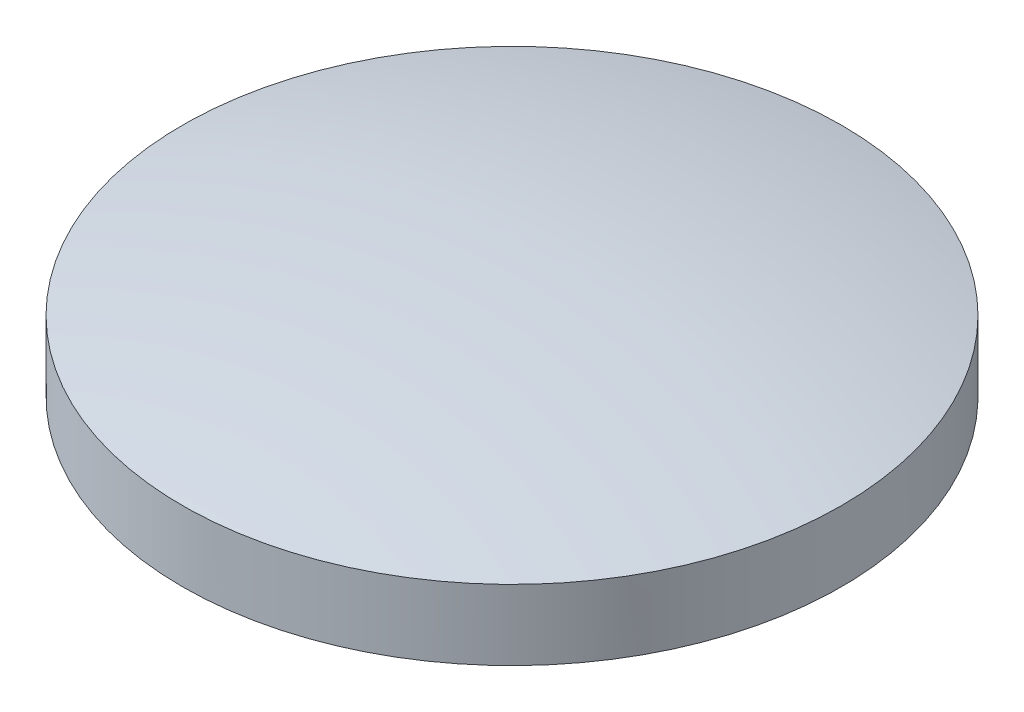
ISO-10303-21;
HEADER;
FILE_DESCRIPTION(('STEP AP214'),'2;1');
FILE_NAME('part.step','',(''),(''),'','','');
FILE_SCHEMA(('AUTOMOTIVE_DESIGN { 1 0 10303 214 1 1 1 1 }'));
ENDSEC;
DATA;
#1=APPLICATION_CONTEXT('core data for automotive mechanical design processes');
#2=APPLICATION_PROTOCOL_DEFINITION('international standard','automotive_design',2000,#1);
#3=PRODUCT_CONTEXT('',#1,'mechanical');
#4=PRODUCT('Part','Part','',(#3));
#5=PRODUCT_RELATED_PRODUCT_CATEGORY('part','',(#4));
#6=PRODUCT_DEFINITION_FORMATION('','',#4);
#7=PRODUCT_DEFINITION_CONTEXT('part definition',#1,'design');
#8=PRODUCT_DEFINITION('design','',#6,#7);
#9=PRODUCT_DEFINITION_SHAPE('','',#8);
#10=(LENGTH_UNIT() NAMED_UNIT(*) SI_UNIT(.MILLI.,.METRE.));
#11=(NAMED_UNIT(*) PLANE_ANGLE_UNIT() SI_UNIT($,.RADIAN.));
#12=(NAMED_UNIT(*) SI_UNIT($,.STERADIAN.) SOLID_ANGLE_UNIT());
#13=UNCERTAINTY_MEASURE_WITH_UNIT(LENGTH_MEASURE(1.E-05),#10,'distance_accuracy_value','');
#14=(GEOMETRIC_REPRESENTATION_CONTEXT(3) GLOBAL_UNCERTAINTY_ASSIGNED_CONTEXT((#13)) GLOBAL_UNIT_ASSIGNED_CONTEXT((#10,
#11,#12)) REPRESENTATION_CONTEXT('',''));
#15=CARTESIAN_POINT('',(0.,0.,0.));
#16=DIRECTION('',(0.,0.,1.));
#17=DIRECTION('',(1.,0.,0.));
#18=AXIS2_PLACEMENT_3D('',#15,#16,#17);
#19=CARTESIAN_POINT('',(0.,-219.397338286307,0.));
#20=DIRECTION('',(0.,-1.,0.));
#21=DIRECTION('',(1.,0.,0.));
#22=AXIS2_PLACEMENT_3D('',#19,#20,#21);
#23=SPHERICAL_SURFACE('',#22,239.602638632358);
#24=CARTESIAN_POINT('',(0.,12.7,0.));
#25=DIRECTION('',(0.,-1.,0.));
#26=DIRECTION('',(0.,0.,-1.));
#27=AXIS2_PLACEMENT_3D('',#24,#25,#26);
#28=CIRCLE('',#27,59.5);
#29=CARTESIAN_POINT('',(0.,12.7,-59.5));
#30=VERTEX_POINT('',#29);
#31=EDGE_CURVE('E10',#30,#30,#28,.T.);
#32=ORIENTED_EDGE('',*,*,#31,.F.);
#33=EDGE_LOOP('',(#32));
#34=FACE_BOUND('',#33,.T.);
#35=ADVANCED_FACE('F32',(#34),#23,.T.);
#36=CARTESIAN_POINT('',(0.,0.,0.));
#37=DIRECTION('',(0.,-1.,0.));
#38=DIRECTION('',(0.,0.,-1.));
#39=AXIS2_PLACEMENT_3D('',#36,#37,#38);
#40=CYLINDRICAL_SURFACE('',#39,59.5);
#41=ORIENTED_EDGE('',*,*,#31,.T.);
#42=EDGE_LOOP('',(#41));
#43=FACE_BOUND('',#42,.T.);
#44=CARTESIAN_POINT('',(0.,0.,0.));
#45=DIRECTION('',(0.,-1.,0.));
#46=DIRECTION('',(0.,0.,-1.));
#47=AXIS2_PLACEMENT_3D('',#44,#45,#46);
#48=CIRCLE('',#47,59.5);
#49=CARTESIAN_POINT('',(0.,0.,-59.5));
#50=VERTEX_POINT('',#49);
#51=EDGE_CURVE('E39',#50,#50,#48,.T.);
#52=ORIENTED_EDGE('',*,*,#51,.F.);
#53=EDGE_LOOP('',(#52));
#54=FACE_BOUND('',#53,.T.);
#55=ADVANCED_FACE('F71',(#43,#54),#40,.T.);
#56=CARTESIAN_POINT('',(57.,0.,0.));
#57=DIRECTION('',(0.,-1.,0.));
#58=DIRECTION('',(0.,0.,-1.));
#59=AXIS2_PLACEMENT_3D('',#56,#57,#58);
#60=PLANE('',#59);
#61=ORIENTED_EDGE('',*,*,#51,.T.);
#62=EDGE_LOOP('',(#61));
#63=FACE_BOUND('',#62,.T.);
#64=CARTESIAN_POINT('',(0.,0.,0.));
#65=DIRECTION('',(0.,-1.,0.));
#66=DIRECTION('',(0.,0.,-1.));
#67=AXIS2_PLACEMENT_3D('',#64,#65,#66);
#68=CIRCLE('',#67,57.);
#69=CARTESIAN_POINT('',(0.,0.,-57.));
#70=VERTEX_POINT('',#69);
#71=EDGE_CURVE('E45',#70,#70,#68,.T.);
#72=ORIENTED_EDGE('',*,*,#71,.F.);
#73=EDGE_LOOP('',(#72));
#74=FACE_BOUND('',#73,.T.);
#75=ADVANCED_FACE('F63',(#63,#74),#60,.T.);
#76=CARTESIAN_POINT('',(0.,0.,0.));
#77=DIRECTION('',(0.,-1.,0.));
#78=DIRECTION('',(0.,0.,-1.));
#79=AXIS2_PLACEMENT_3D('',#76,#77,#78);
#80=CYLINDRICAL_SURFACE('',#79,57.);
#81=ORIENTED_EDGE('',*,*,#71,.T.);
#82=EDGE_LOOP('',(#81));
#83=FACE_BOUND('',#82,.T.);
#84=CARTESIAN_POINT('',(0.,10.7518768903402,0.));
#85=DIRECTION('',(0.,-1.,0.));
#86=DIRECTION('',(0.,0.,-1.));
#87=AXIS2_PLACEMENT_3D('',#84,#85,#86);
#88=CIRCLE('',#87,57.);
#89=CARTESIAN_POINT('',(0.,10.7518768903402,-57.));
#90=VERTEX_POINT('',#89);
#91=EDGE_CURVE('E51',#90,#90,#88,.T.);
#92=ORIENTED_EDGE('',*,*,#91,.F.);
#93=EDGE_LOOP('',(#92));
#94=FACE_BOUND('',#93,.T.);
#95=ADVANCED_FACE('F61',(#83,#94),#80,.F.);
#96=CARTESIAN_POINT('',(0.,-219.397338286307,0.));
#97=DIRECTION('',(0.,-1.,0.));
#98=DIRECTION('',(1.,0.,0.));
#99=AXIS2_PLACEMENT_3D('',#96,#97,#98);
#100=SPHERICAL_SURFACE('',#99,237.102638632358);
#101=ORIENTED_EDGE('',*,*,#91,.T.);
#102=EDGE_LOOP('',(#101));
#103=FACE_BOUND('',#102,.T.);
#104=ADVANCED_FACE('F59',(#103),#100,.F.);
#105=CLOSED_SHELL('',(#35,#55,#75,#95,#104));
#106=MANIFOLD_SOLID_BREP('B2',#105);
#107=ADVANCED_BREP_SHAPE_REPRESENTATION('',(#18,#106),#14);
#108=SHAPE_DEFINITION_REPRESENTATION(#9,#107);
ENDSEC;
END-ISO-10303-21;
